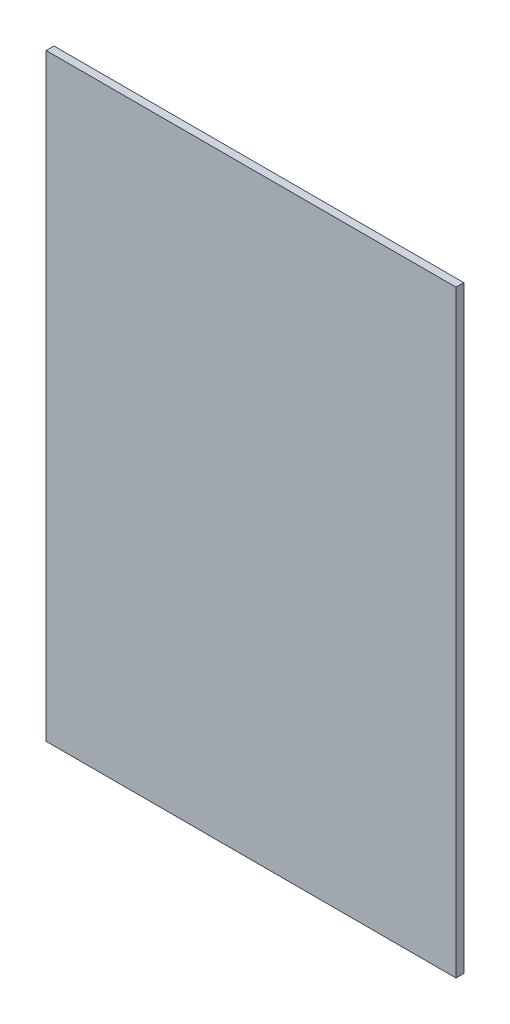
ISO-10303-21;
HEADER;
FILE_DESCRIPTION(('STEP AP214'),'2;1');
FILE_NAME('part.step','',(''),(''),'','','');
FILE_SCHEMA(('AUTOMOTIVE_DESIGN { 1 0 10303 214 1 1 1 1 }'));
ENDSEC;
DATA;
#1=APPLICATION_CONTEXT('core data for automotive mechanical design processes');
#2=APPLICATION_PROTOCOL_DEFINITION('international standard','automotive_design',2000,#1);
#3=PRODUCT_CONTEXT('',#1,'mechanical');
#4=PRODUCT('Part','Part','',(#3));
#5=PRODUCT_RELATED_PRODUCT_CATEGORY('part','',(#4));
#6=PRODUCT_DEFINITION_FORMATION('','',#4);
#7=PRODUCT_DEFINITION_CONTEXT('part definition',#1,'design');
#8=PRODUCT_DEFINITION('design','',#6,#7);
#9=PRODUCT_DEFINITION_SHAPE('','',#8);
#10=(LENGTH_UNIT() NAMED_UNIT(*) SI_UNIT(.MILLI.,.METRE.));
#11=(NAMED_UNIT(*) PLANE_ANGLE_UNIT() SI_UNIT($,.RADIAN.));
#12=(NAMED_UNIT(*) SI_UNIT($,.STERADIAN.) SOLID_ANGLE_UNIT());
#13=UNCERTAINTY_MEASURE_WITH_UNIT(LENGTH_MEASURE(1.E-05),#10,'distance_accuracy_value','');
#14=(GEOMETRIC_REPRESENTATION_CONTEXT(3) GLOBAL_UNCERTAINTY_ASSIGNED_CONTEXT((#13)) GLOBAL_UNIT_ASSIGNED_CONTEXT((#10,
#11,#12)) REPRESENTATION_CONTEXT('',''));
#15=CARTESIAN_POINT('',(0.,0.,0.));
#16=DIRECTION('',(0.,0.,1.));
#17=DIRECTION('',(1.,0.,0.));
#18=AXIS2_PLACEMENT_3D('',#15,#16,#17);
#19=CARTESIAN_POINT('',(0.,0.,3.175));
#20=DIRECTION('',(1.,0.,0.));
#21=DIRECTION('',(0.,0.,-1.));
#22=AXIS2_PLACEMENT_3D('',#19,#20,#21);
#23=PLANE('',#22);
#24=DIRECTION('',(0.,-1.,0.));
#25=VECTOR('',#24,1.);
#26=CARTESIAN_POINT('',(0.,0.,0.));
#27=LINE('',#26,#25);
#28=CARTESIAN_POINT('',(0.,242.52,0.));
#29=VERTEX_POINT('',#28);
#30=CARTESIAN_POINT('',(0.,0.,0.));
#31=VERTEX_POINT('',#30);
#32=EDGE_CURVE('E99',#29,#31,#27,.T.);
#33=ORIENTED_EDGE('',*,*,#32,.T.);
#34=DIRECTION('',(0.,0.,-1.));
#35=VECTOR('',#34,1.);
#36=CARTESIAN_POINT('',(0.,0.,3.175));
#37=LINE('',#36,#35);
#38=CARTESIAN_POINT('',(0.,0.,3.175));
#39=VERTEX_POINT('',#38);
#40=EDGE_CURVE('E11',#39,#31,#37,.T.);
#41=ORIENTED_EDGE('',*,*,#40,.F.);
#42=DIRECTION('',(0.,-1.,0.));
#43=VECTOR('',#42,1.);
#44=CARTESIAN_POINT('',(0.,0.,3.175));
#45=LINE('',#44,#43);
#46=CARTESIAN_POINT('',(0.,242.52,3.175));
#47=VERTEX_POINT('',#46);
#48=EDGE_CURVE('E87',#47,#39,#45,.T.);
#49=ORIENTED_EDGE('',*,*,#48,.F.);
#50=DIRECTION('',(0.,0.,-1.));
#51=VECTOR('',#50,1.);
#52=CARTESIAN_POINT('',(0.,242.52,3.175));
#53=LINE('',#52,#51);
#54=EDGE_CURVE('E95',#47,#29,#53,.T.);
#55=ORIENTED_EDGE('',*,*,#54,.T.);
#56=EDGE_LOOP('',(#33,#41,#49,#55));
#57=FACE_BOUND('',#56,.T.);
#58=ADVANCED_FACE('F36',(#57),#23,.F.);
#59=CARTESIAN_POINT('',(0.,0.,3.175));
#60=DIRECTION('',(0.,1.,0.));
#61=DIRECTION('',(0.,0.,1.));
#62=AXIS2_PLACEMENT_3D('',#59,#60,#61);
#63=PLANE('',#62);
#64=DIRECTION('',(1.,0.,0.));
#65=VECTOR('',#64,1.);
#66=CARTESIAN_POINT('',(0.,0.,0.));
#67=LINE('',#66,#65);
#68=CARTESIAN_POINT('',(166.124,0.,0.));
#69=VERTEX_POINT('',#68);
#70=EDGE_CURVE('E91',#31,#69,#67,.T.);
#71=ORIENTED_EDGE('',*,*,#70,.T.);
#72=DIRECTION('',(0.,0.,-1.));
#73=VECTOR('',#72,1.);
#74=CARTESIAN_POINT('',(166.124,0.,3.175));
#75=LINE('',#74,#73);
#76=CARTESIAN_POINT('',(166.124,0.,3.175));
#77=VERTEX_POINT('',#76);
#78=EDGE_CURVE('E44',#77,#69,#75,.T.);
#79=ORIENTED_EDGE('',*,*,#78,.F.);
#80=DIRECTION('',(1.,0.,0.));
#81=VECTOR('',#80,1.);
#82=CARTESIAN_POINT('',(0.,0.,3.175));
#83=LINE('',#82,#81);
#84=EDGE_CURVE('E82',#39,#77,#83,.T.);
#85=ORIENTED_EDGE('',*,*,#84,.F.);
#86=ORIENTED_EDGE('',*,*,#40,.T.);
#87=EDGE_LOOP('',(#71,#79,#85,#86));
#88=FACE_BOUND('',#87,.T.);
#89=ADVANCED_FACE('F90',(#88),#63,.F.);
#90=CARTESIAN_POINT('',(166.124,0.,3.175));
#91=DIRECTION('',(-1.,0.,0.));
#92=DIRECTION('',(0.,0.,1.));
#93=AXIS2_PLACEMENT_3D('',#90,#91,#92);
#94=PLANE('',#93);
#95=DIRECTION('',(0.,1.,0.));
#96=VECTOR('',#95,1.);
#97=CARTESIAN_POINT('',(166.124,0.,0.));
#98=LINE('',#97,#96);
#99=CARTESIAN_POINT('',(166.124,242.52,0.));
#100=VERTEX_POINT('',#99);
#101=EDGE_CURVE('E69',#69,#100,#98,.T.);
#102=ORIENTED_EDGE('',*,*,#101,.T.);
#103=DIRECTION('',(0.,0.,-1.));
#104=VECTOR('',#103,1.);
#105=CARTESIAN_POINT('',(166.124,242.52,3.175));
#106=LINE('',#105,#104);
#107=CARTESIAN_POINT('',(166.124,242.52,3.175));
#108=VERTEX_POINT('',#107);
#109=EDGE_CURVE('E92',#108,#100,#106,.T.);
#110=ORIENTED_EDGE('',*,*,#109,.F.);
#111=DIRECTION('',(0.,1.,0.));
#112=VECTOR('',#111,1.);
#113=CARTESIAN_POINT('',(166.124,0.,3.175));
#114=LINE('',#113,#112);
#115=EDGE_CURVE('E85',#77,#108,#114,.T.);
#116=ORIENTED_EDGE('',*,*,#115,.F.);
#117=ORIENTED_EDGE('',*,*,#78,.T.);
#118=EDGE_LOOP('',(#102,#110,#116,#117));
#119=FACE_BOUND('',#118,.T.);
#120=ADVANCED_FACE('F93',(#119),#94,.F.);
#121=CARTESIAN_POINT('',(0.,242.52,3.175));
#122=DIRECTION('',(0.,-1.,0.));
#123=DIRECTION('',(0.,0.,-1.));
#124=AXIS2_PLACEMENT_3D('',#121,#122,#123);
#125=PLANE('',#124);
#126=DIRECTION('',(-1.,0.,0.));
#127=VECTOR('',#126,1.);
#128=CARTESIAN_POINT('',(0.,242.52,0.));
#129=LINE('',#128,#127);
#130=EDGE_CURVE('E75',#100,#29,#129,.T.);
#131=ORIENTED_EDGE('',*,*,#130,.T.);
#132=ORIENTED_EDGE('',*,*,#54,.F.);
#133=DIRECTION('',(-1.,0.,0.));
#134=VECTOR('',#133,1.);
#135=CARTESIAN_POINT('',(0.,242.52,3.175));
#136=LINE('',#135,#134);
#137=EDGE_CURVE('E52',#108,#47,#136,.T.);
#138=ORIENTED_EDGE('',*,*,#137,.F.);
#139=ORIENTED_EDGE('',*,*,#109,.T.);
#140=EDGE_LOOP('',(#131,#132,#138,#139));
#141=FACE_BOUND('',#140,.T.);
#142=ADVANCED_FACE('F106',(#141),#125,.F.);
#143=CARTESIAN_POINT('',(0.,0.,3.175));
#144=DIRECTION('',(0.,0.,-1.));
#145=DIRECTION('',(-1.,0.,0.));
#146=AXIS2_PLACEMENT_3D('',#143,#144,#145);
#147=PLANE('',#146);
#148=ORIENTED_EDGE('',*,*,#48,.T.);
#149=ORIENTED_EDGE('',*,*,#84,.T.);
#150=ORIENTED_EDGE('',*,*,#115,.T.);
#151=ORIENTED_EDGE('',*,*,#137,.T.);
#152=EDGE_LOOP('',(#148,#149,#150,#151));
#153=FACE_BOUND('',#152,.T.);
#154=ADVANCED_FACE('F83',(#153),#147,.F.);
#155=CARTESIAN_POINT('',(0.,0.,0.));
#156=DIRECTION('',(0.,0.,-1.));
#157=DIRECTION('',(-1.,0.,0.));
#158=AXIS2_PLACEMENT_3D('',#155,#156,#157);
#159=PLANE('',#158);
#160=ORIENTED_EDGE('',*,*,#32,.F.);
#161=ORIENTED_EDGE('',*,*,#130,.F.);
#162=ORIENTED_EDGE('',*,*,#101,.F.);
#163=ORIENTED_EDGE('',*,*,#70,.F.);
#164=EDGE_LOOP('',(#160,#161,#162,#163));
#165=FACE_BOUND('',#164,.T.);
#166=ADVANCED_FACE('F109',(#165),#159,.T.);
#167=CLOSED_SHELL('',(#58,#89,#120,#142,#154,#166));
#168=MANIFOLD_SOLID_BREP('B2',#167);
#169=ADVANCED_BREP_SHAPE_REPRESENTATION('',(#18,#168),#14);
#170=SHAPE_DEFINITION_REPRESENTATION(#9,#169);
ENDSEC;
END-ISO-10303-21;
